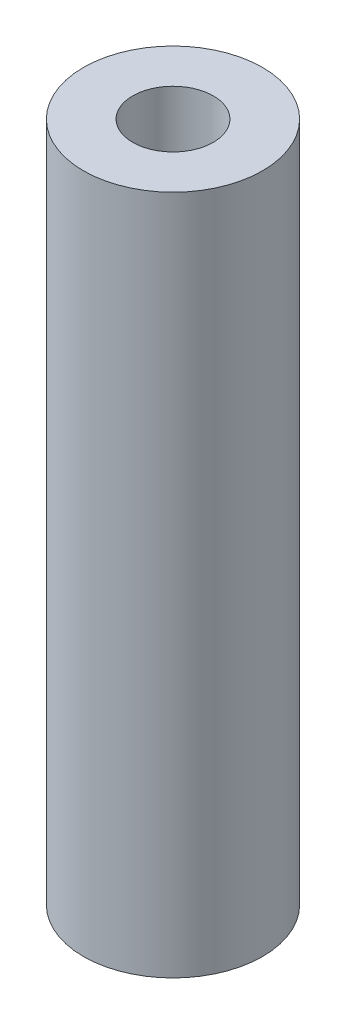
ISO-10303-21;
HEADER;
FILE_DESCRIPTION(('STEP AP214'),'2;1');
FILE_NAME('part.step','',(''),(''),'','','');
FILE_SCHEMA(('AUTOMOTIVE_DESIGN { 1 0 10303 214 1 1 1 1 }'));
ENDSEC;
DATA;
#1=APPLICATION_CONTEXT('core data for automotive mechanical design processes');
#2=APPLICATION_PROTOCOL_DEFINITION('international standard','automotive_design',2000,#1);
#3=PRODUCT_CONTEXT('',#1,'mechanical');
#4=PRODUCT('Part','Part','',(#3));
#5=PRODUCT_RELATED_PRODUCT_CATEGORY('part','',(#4));
#6=PRODUCT_DEFINITION_FORMATION('','',#4);
#7=PRODUCT_DEFINITION_CONTEXT('part definition',#1,'design');
#8=PRODUCT_DEFINITION('design','',#6,#7);
#9=PRODUCT_DEFINITION_SHAPE('','',#8);
#10=(LENGTH_UNIT() NAMED_UNIT(*) SI_UNIT(.MILLI.,.METRE.));
#11=(NAMED_UNIT(*) PLANE_ANGLE_UNIT() SI_UNIT($,.RADIAN.));
#12=(NAMED_UNIT(*) SI_UNIT($,.STERADIAN.) SOLID_ANGLE_UNIT());
#13=UNCERTAINTY_MEASURE_WITH_UNIT(LENGTH_MEASURE(1.E-05),#10,'distance_accuracy_value','');
#14=(GEOMETRIC_REPRESENTATION_CONTEXT(3) GLOBAL_UNCERTAINTY_ASSIGNED_CONTEXT((#13)) GLOBAL_UNIT_ASSIGNED_CONTEXT((#10,
#11,#12)) REPRESENTATION_CONTEXT('',''));
#15=CARTESIAN_POINT('',(0.,0.,0.));
#16=DIRECTION('',(0.,0.,1.));
#17=DIRECTION('',(1.,0.,0.));
#18=AXIS2_PLACEMENT_3D('',#15,#16,#17);
#19=CARTESIAN_POINT('',(0.,19.,0.));
#20=DIRECTION('',(0.,-1.,0.));
#21=DIRECTION('',(0.,0.,-1.));
#22=AXIS2_PLACEMENT_3D('',#19,#20,#21);
#23=CYLINDRICAL_SURFACE('',#22,5.);
#24=CARTESIAN_POINT('',(0.,19.,0.));
#25=DIRECTION('',(0.,1.,0.));
#26=DIRECTION('',(0.,0.,1.));
#27=AXIS2_PLACEMENT_3D('',#24,#25,#26);
#28=CIRCLE('',#27,5.);
#29=CARTESIAN_POINT('',(0.,19.,5.));
#30=VERTEX_POINT('',#29);
#31=EDGE_CURVE('E10',#30,#30,#28,.T.);
#32=ORIENTED_EDGE('',*,*,#31,.F.);
#33=EDGE_LOOP('',(#32));
#34=FACE_BOUND('',#33,.T.);
#35=CARTESIAN_POINT('',(0.,-19.,0.));
#36=DIRECTION('',(0.,1.,0.));
#37=DIRECTION('',(0.,0.,1.));
#38=AXIS2_PLACEMENT_3D('',#35,#36,#37);
#39=CIRCLE('',#38,5.);
#40=CARTESIAN_POINT('',(0.,-19.,5.));
#41=VERTEX_POINT('',#40);
#42=EDGE_CURVE('E36',#41,#41,#39,.T.);
#43=ORIENTED_EDGE('',*,*,#42,.T.);
#44=EDGE_LOOP('',(#43));
#45=FACE_BOUND('',#44,.T.);
#46=ADVANCED_FACE('F33',(#34,#45),#23,.T.);
#47=CARTESIAN_POINT('',(0.,19.,0.));
#48=DIRECTION('',(0.,1.,0.));
#49=DIRECTION('',(0.,0.,1.));
#50=AXIS2_PLACEMENT_3D('',#47,#48,#49);
#51=PLANE('',#50);
#52=CARTESIAN_POINT('',(0.,19.,0.));
#53=DIRECTION('',(0.,1.,0.));
#54=DIRECTION('',(0.,0.,1.));
#55=AXIS2_PLACEMENT_3D('',#52,#53,#54);
#56=CIRCLE('',#55,2.24999999999999);
#57=CARTESIAN_POINT('',(0.,19.,2.24999999999999));
#58=VERTEX_POINT('',#57);
#59=EDGE_CURVE('E47',#58,#58,#56,.T.);
#60=ORIENTED_EDGE('',*,*,#59,.F.);
#61=EDGE_LOOP('',(#60));
#62=FACE_BOUND('',#61,.T.);
#63=ORIENTED_EDGE('',*,*,#31,.T.);
#64=EDGE_LOOP('',(#63));
#65=FACE_BOUND('',#64,.T.);
#66=ADVANCED_FACE('F53',(#62,#65),#51,.T.);
#67=CARTESIAN_POINT('',(0.,-19.,0.));
#68=DIRECTION('',(0.,1.,0.));
#69=DIRECTION('',(0.,0.,1.));
#70=AXIS2_PLACEMENT_3D('',#67,#68,#69);
#71=PLANE('',#70);
#72=CARTESIAN_POINT('',(0.,-19.,0.));
#73=DIRECTION('',(0.,1.,0.));
#74=DIRECTION('',(0.,0.,1.));
#75=AXIS2_PLACEMENT_3D('',#72,#73,#74);
#76=CIRCLE('',#75,2.25);
#77=CARTESIAN_POINT('',(0.,-19.,2.25));
#78=VERTEX_POINT('',#77);
#79=EDGE_CURVE('E43',#78,#78,#76,.T.);
#80=ORIENTED_EDGE('',*,*,#79,.T.);
#81=EDGE_LOOP('',(#80));
#82=FACE_BOUND('',#81,.T.);
#83=ORIENTED_EDGE('',*,*,#42,.F.);
#84=EDGE_LOOP('',(#83));
#85=FACE_BOUND('',#84,.T.);
#86=ADVANCED_FACE('F55',(#82,#85),#71,.F.);
#87=CARTESIAN_POINT('',(0.,19.,0.));
#88=DIRECTION('',(0.,1.,0.));
#89=DIRECTION('',(0.,0.,1.));
#90=AXIS2_PLACEMENT_3D('',#87,#88,#89);
#91=CYLINDRICAL_SURFACE('',#90,2.24999999999999);
#92=ORIENTED_EDGE('',*,*,#79,.F.);
#93=EDGE_LOOP('',(#92));
#94=FACE_BOUND('',#93,.T.);
#95=ORIENTED_EDGE('',*,*,#59,.T.);
#96=EDGE_LOOP('',(#95));
#97=FACE_BOUND('',#96,.T.);
#98=ADVANCED_FACE('F51',(#94,#97),#91,.F.);
#99=CLOSED_SHELL('',(#46,#66,#86,#98));
#100=MANIFOLD_SOLID_BREP('B2',#99);
#101=ADVANCED_BREP_SHAPE_REPRESENTATION('',(#18,#100),#14);
#102=SHAPE_DEFINITION_REPRESENTATION(#9,#101);
ENDSEC;
END-ISO-10303-21;
